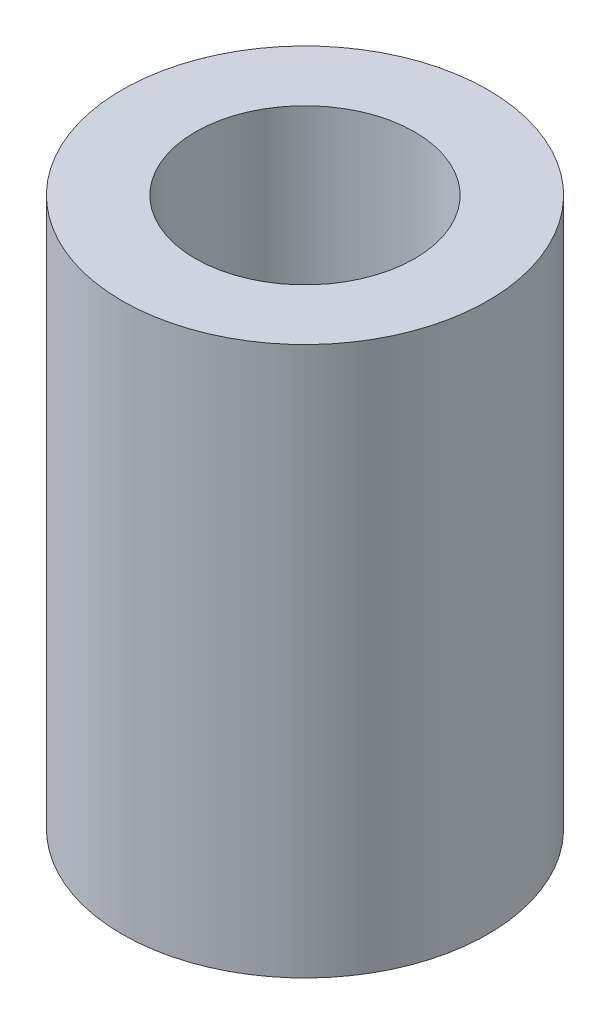
ISO-10303-21;
HEADER;
FILE_DESCRIPTION(('STEP AP214'),'2;1');
FILE_NAME('part.step','',(''),(''),'','','');
FILE_SCHEMA(('AUTOMOTIVE_DESIGN { 1 0 10303 214 1 1 1 1 }'));
ENDSEC;
DATA;
#1=APPLICATION_CONTEXT('core data for automotive mechanical design processes');
#2=APPLICATION_PROTOCOL_DEFINITION('international standard','automotive_design',2000,#1);
#3=PRODUCT_CONTEXT('',#1,'mechanical');
#4=PRODUCT('Part','Part','',(#3));
#5=PRODUCT_RELATED_PRODUCT_CATEGORY('part','',(#4));
#6=PRODUCT_DEFINITION_FORMATION('','',#4);
#7=PRODUCT_DEFINITION_CONTEXT('part definition',#1,'design');
#8=PRODUCT_DEFINITION('design','',#6,#7);
#9=PRODUCT_DEFINITION_SHAPE('','',#8);
#10=(LENGTH_UNIT() NAMED_UNIT(*) SI_UNIT(.MILLI.,.METRE.));
#11=(NAMED_UNIT(*) PLANE_ANGLE_UNIT() SI_UNIT($,.RADIAN.));
#12=(NAMED_UNIT(*) SI_UNIT($,.STERADIAN.) SOLID_ANGLE_UNIT());
#13=UNCERTAINTY_MEASURE_WITH_UNIT(LENGTH_MEASURE(1.E-05),#10,'distance_accuracy_value','');
#14=(GEOMETRIC_REPRESENTATION_CONTEXT(3) GLOBAL_UNCERTAINTY_ASSIGNED_CONTEXT((#13)) GLOBAL_UNIT_ASSIGNED_CONTEXT((#10,
#11,#12)) REPRESENTATION_CONTEXT('',''));
#15=CARTESIAN_POINT('',(0.,0.,0.));
#16=DIRECTION('',(0.,0.,1.));
#17=DIRECTION('',(1.,0.,0.));
#18=AXIS2_PLACEMENT_3D('',#15,#16,#17);
#19=CARTESIAN_POINT('',(-9.99999999999994,30.,10.));
#20=DIRECTION('',(0.,1.,0.));
#21=DIRECTION('',(0.,0.,1.));
#22=AXIS2_PLACEMENT_3D('',#19,#20,#21);
#23=PLANE('',#22);
#24=CARTESIAN_POINT('',(-9.99999999999994,30.,10.));
#25=DIRECTION('',(0.,1.,0.));
#26=DIRECTION('',(0.,0.,1.));
#27=AXIS2_PLACEMENT_3D('',#24,#25,#26);
#28=CIRCLE('',#27,10.);
#29=CARTESIAN_POINT('',(-9.99999999999994,30.,20.));
#30=VERTEX_POINT('',#29);
#31=EDGE_CURVE('E10',#30,#30,#28,.T.);
#32=ORIENTED_EDGE('',*,*,#31,.T.);
#33=EDGE_LOOP('',(#32));
#34=FACE_BOUND('',#33,.T.);
#35=CARTESIAN_POINT('',(-9.99999999999994,30.,10.));
#36=DIRECTION('',(0.,1.,0.));
#37=DIRECTION('',(0.,0.,1.));
#38=AXIS2_PLACEMENT_3D('',#35,#36,#37);
#39=CIRCLE('',#38,6.);
#40=CARTESIAN_POINT('',(-9.99999999999994,30.,16.));
#41=VERTEX_POINT('',#40);
#42=EDGE_CURVE('E44',#41,#41,#39,.T.);
#43=ORIENTED_EDGE('',*,*,#42,.F.);
#44=EDGE_LOOP('',(#43));
#45=FACE_BOUND('',#44,.T.);
#46=ADVANCED_FACE('F33',(#34,#45),#23,.T.);
#47=CARTESIAN_POINT('',(-9.99999999999994,0.,10.));
#48=DIRECTION('',(0.,1.,0.));
#49=DIRECTION('',(0.,0.,1.));
#50=AXIS2_PLACEMENT_3D('',#47,#48,#49);
#51=PLANE('',#50);
#52=CARTESIAN_POINT('',(-9.99999999999994,0.,10.));
#53=DIRECTION('',(0.,1.,0.));
#54=DIRECTION('',(0.,0.,1.));
#55=AXIS2_PLACEMENT_3D('',#52,#53,#54);
#56=CIRCLE('',#55,10.);
#57=CARTESIAN_POINT('',(-9.99999999999994,0.,20.));
#58=VERTEX_POINT('',#57);
#59=EDGE_CURVE('E37',#58,#58,#56,.T.);
#60=ORIENTED_EDGE('',*,*,#59,.F.);
#61=EDGE_LOOP('',(#60));
#62=FACE_BOUND('',#61,.T.);
#63=CARTESIAN_POINT('',(-9.99999999999994,0.,10.));
#64=DIRECTION('',(0.,1.,0.));
#65=DIRECTION('',(0.,0.,1.));
#66=AXIS2_PLACEMENT_3D('',#63,#64,#65);
#67=CIRCLE('',#66,6.);
#68=CARTESIAN_POINT('',(-9.99999999999994,0.,16.));
#69=VERTEX_POINT('',#68);
#70=EDGE_CURVE('E46',#69,#69,#67,.T.);
#71=ORIENTED_EDGE('',*,*,#70,.T.);
#72=EDGE_LOOP('',(#71));
#73=FACE_BOUND('',#72,.T.);
#74=ADVANCED_FACE('F56',(#62,#73),#51,.F.);
#75=CARTESIAN_POINT('',(-9.99999999999994,30.,10.));
#76=DIRECTION('',(0.,-1.,0.));
#77=DIRECTION('',(0.,0.,-1.));
#78=AXIS2_PLACEMENT_3D('',#75,#76,#77);
#79=CYLINDRICAL_SURFACE('',#78,10.);
#80=ORIENTED_EDGE('',*,*,#31,.F.);
#81=EDGE_LOOP('',(#80));
#82=FACE_BOUND('',#81,.T.);
#83=ORIENTED_EDGE('',*,*,#59,.T.);
#84=EDGE_LOOP('',(#83));
#85=FACE_BOUND('',#84,.T.);
#86=ADVANCED_FACE('F35',(#82,#85),#79,.T.);
#87=CARTESIAN_POINT('',(-9.99999999999994,30.,10.));
#88=DIRECTION('',(0.,-1.,0.));
#89=DIRECTION('',(0.,0.,-1.));
#90=AXIS2_PLACEMENT_3D('',#87,#88,#89);
#91=CYLINDRICAL_SURFACE('',#90,6.);
#92=ORIENTED_EDGE('',*,*,#42,.T.);
#93=EDGE_LOOP('',(#92));
#94=FACE_BOUND('',#93,.T.);
#95=ORIENTED_EDGE('',*,*,#70,.F.);
#96=EDGE_LOOP('',(#95));
#97=FACE_BOUND('',#96,.T.);
#98=ADVANCED_FACE('F52',(#94,#97),#91,.F.);
#99=CLOSED_SHELL('',(#46,#74,#86,#98));
#100=MANIFOLD_SOLID_BREP('B2',#99);
#101=ADVANCED_BREP_SHAPE_REPRESENTATION('',(#18,#100),#14);
#102=SHAPE_DEFINITION_REPRESENTATION(#9,#101);
ENDSEC;
END-ISO-10303-21;
